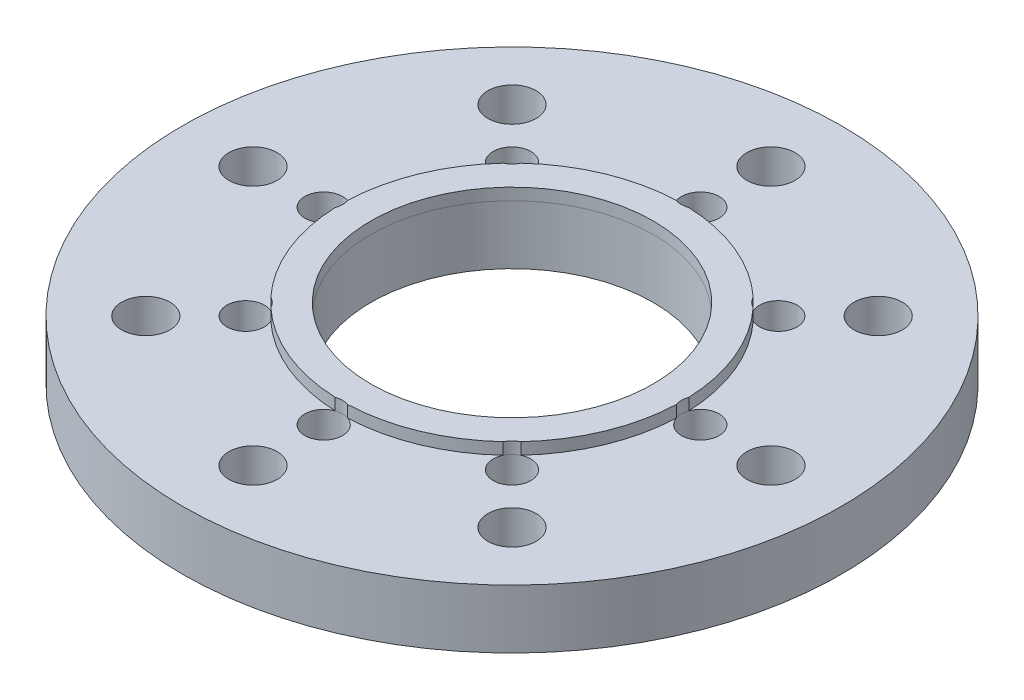
ISO-10303-21;
HEADER;
FILE_DESCRIPTION(('STEP AP214'),'2;1');
FILE_NAME('part.step','',(''),(''),'','','');
FILE_SCHEMA(('AUTOMOTIVE_DESIGN { 1 0 10303 214 1 1 1 1 }'));
ENDSEC;
DATA;
#1=APPLICATION_CONTEXT('core data for automotive mechanical design processes');
#2=APPLICATION_PROTOCOL_DEFINITION('international standard','automotive_design',2000,#1);
#3=PRODUCT_CONTEXT('',#1,'mechanical');
#4=PRODUCT('Part','Part','',(#3));
#5=PRODUCT_RELATED_PRODUCT_CATEGORY('part','',(#4));
#6=PRODUCT_DEFINITION_FORMATION('','',#4);
#7=PRODUCT_DEFINITION_CONTEXT('part definition',#1,'design');
#8=PRODUCT_DEFINITION('design','',#6,#7);
#9=PRODUCT_DEFINITION_SHAPE('','',#8);
#10=(LENGTH_UNIT() NAMED_UNIT(*) SI_UNIT(.MILLI.,.METRE.));
#11=(NAMED_UNIT(*) PLANE_ANGLE_UNIT() SI_UNIT($,.RADIAN.));
#12=(NAMED_UNIT(*) SI_UNIT($,.STERADIAN.) SOLID_ANGLE_UNIT());
#13=UNCERTAINTY_MEASURE_WITH_UNIT(LENGTH_MEASURE(1.E-05),#10,'distance_accuracy_value','');
#14=(GEOMETRIC_REPRESENTATION_CONTEXT(3) GLOBAL_UNCERTAINTY_ASSIGNED_CONTEXT((#13)) GLOBAL_UNIT_ASSIGNED_CONTEXT((#10,
#11,#12)) REPRESENTATION_CONTEXT('',''));
#15=CARTESIAN_POINT('',(0.,0.,0.));
#16=DIRECTION('',(0.,0.,1.));
#17=DIRECTION('',(1.,0.,0.));
#18=AXIS2_PLACEMENT_3D('',#15,#16,#17);
#19=CARTESIAN_POINT('',(0.,3.,0.));
#20=DIRECTION('',(0.,-1.,0.));
#21=DIRECTION('',(0.,0.,-1.));
#22=AXIS2_PLACEMENT_3D('',#19,#20,#21);
#23=CYLINDRICAL_SURFACE('',#22,7.25);
#24=CARTESIAN_POINT('',(0.,2.5,0.));
#25=DIRECTION('',(0.,1.,0.));
#26=DIRECTION('',(0.,0.,1.));
#27=AXIS2_PLACEMENT_3D('',#24,#25,#26);
#28=CIRCLE('',#27,7.25);
#29=CARTESIAN_POINT('',(-5.310463616953,2.5,-4.9357346133092));
#30=VERTEX_POINT('',#29);
#31=CARTESIAN_POINT('',(-7.24515625,2.5,-0.264973419583771));
#32=VERTEX_POINT('',#31);
#33=EDGE_CURVE('E194',#30,#32,#28,.T.);
#34=ORIENTED_EDGE('',*,*,#33,.T.);
#35=DIRECTION('',(0.,1.,0.));
#36=VECTOR('',#35,1.);
#37=CARTESIAN_POINT('',(-7.24515625,1.5,-0.264973419583772));
#38=LINE('',#37,#36);
#39=CARTESIAN_POINT('',(-7.24515625,3.,-0.264973419583774));
#40=VERTEX_POINT('',#39);
#41=EDGE_CURVE('E176',#32,#40,#38,.T.);
#42=ORIENTED_EDGE('',*,*,#41,.T.);
#43=CARTESIAN_POINT('',(0.,3.,0.));
#44=DIRECTION('',(0.,1.,0.));
#45=DIRECTION('',(0.,0.,1.));
#46=AXIS2_PLACEMENT_3D('',#43,#44,#45);
#47=CIRCLE('',#46,7.25);
#48=CARTESIAN_POINT('',(-5.310463616953,3.,-4.93573461330919));
#49=VERTEX_POINT('',#48);
#50=EDGE_CURVE('E175',#49,#40,#47,.T.);
#51=ORIENTED_EDGE('',*,*,#50,.F.);
#52=DIRECTION('',(0.,1.,0.));
#53=VECTOR('',#52,1.);
#54=CARTESIAN_POINT('',(-5.31046361695299,1.5,-4.93573461330919));
#55=LINE('',#54,#53);
#56=EDGE_CURVE('E217',#49,#30,#55,.F.);
#57=ORIENTED_EDGE('',*,*,#56,.T.);
#58=EDGE_LOOP('',(#34,#42,#51,#57));
#59=FACE_BOUND('',#58,.T.);
#60=ADVANCED_FACE('F42',(#59),#23,.T.);
#61=CARTESIAN_POINT('',(-7.24515625,3.,0.264973419583825));
#62=VERTEX_POINT('',#61);
#63=CARTESIAN_POINT('',(-5.31046361695296,3.,4.93573461330923));
#64=VERTEX_POINT('',#63);
#65=EDGE_CURVE('E172',#62,#64,#47,.T.);
#66=ORIENTED_EDGE('',*,*,#65,.F.);
#67=DIRECTION('',(0.,1.,0.));
#68=VECTOR('',#67,1.);
#69=CARTESIAN_POINT('',(-7.24515625,1.5,0.264973419583823));
#70=LINE('',#69,#68);
#71=CARTESIAN_POINT('',(-7.24515625,2.5,0.264973419583823));
#72=VERTEX_POINT('',#71);
#73=EDGE_CURVE('E154',#62,#72,#70,.F.);
#74=ORIENTED_EDGE('',*,*,#73,.T.);
#75=CARTESIAN_POINT('',(-5.31046361695296,2.5,4.93573461330924));
#76=VERTEX_POINT('',#75);
#77=EDGE_CURVE('E257',#72,#76,#28,.T.);
#78=ORIENTED_EDGE('',*,*,#77,.T.);
#79=DIRECTION('',(0.,1.,0.));
#80=VECTOR('',#79,1.);
#81=CARTESIAN_POINT('',(-5.31046361695296,1.5,4.93573461330923));
#82=LINE('',#81,#80);
#83=EDGE_CURVE('E180',#76,#64,#82,.T.);
#84=ORIENTED_EDGE('',*,*,#83,.T.);
#85=EDGE_LOOP('',(#66,#74,#78,#84));
#86=FACE_BOUND('',#85,.T.);
#87=ADVANCED_FACE('F179',(#86),#23,.T.);
#88=CARTESIAN_POINT('',(-4.93573461330918,3.,5.31046361695301));
#89=VERTEX_POINT('',#88);
#90=CARTESIAN_POINT('',(-0.264973419583799,3.,7.24515625));
#91=VERTEX_POINT('',#90);
#92=EDGE_CURVE('E181',#89,#91,#47,.T.);
#93=ORIENTED_EDGE('',*,*,#92,.F.);
#94=DIRECTION('',(0.,1.,0.));
#95=VECTOR('',#94,1.);
#96=CARTESIAN_POINT('',(-4.93573461330918,1.5,5.31046361695301));
#97=LINE('',#96,#95);
#98=CARTESIAN_POINT('',(-4.93573461330918,2.5,5.31046361695302));
#99=VERTEX_POINT('',#98);
#100=EDGE_CURVE('E327',#89,#99,#97,.F.);
#101=ORIENTED_EDGE('',*,*,#100,.T.);
#102=CARTESIAN_POINT('',(-0.264973419583796,2.5,7.24515625));
#103=VERTEX_POINT('',#102);
#104=EDGE_CURVE('E258',#99,#103,#28,.T.);
#105=ORIENTED_EDGE('',*,*,#104,.T.);
#106=DIRECTION('',(0.,1.,0.));
#107=VECTOR('',#106,1.);
#108=CARTESIAN_POINT('',(-0.264973419583798,1.5,7.24515625));
#109=LINE('',#108,#107);
#110=EDGE_CURVE('E308',#103,#91,#109,.T.);
#111=ORIENTED_EDGE('',*,*,#110,.T.);
#112=EDGE_LOOP('',(#93,#101,#105,#111));
#113=FACE_BOUND('',#112,.T.);
#114=ADVANCED_FACE('F256',(#113),#23,.T.);
#115=CARTESIAN_POINT('',(0.264973419583799,3.,7.24515625));
#116=VERTEX_POINT('',#115);
#117=CARTESIAN_POINT('',(4.93573461330925,3.,5.31046361695295));
#118=VERTEX_POINT('',#117);
#119=EDGE_CURVE('E185',#116,#118,#47,.T.);
#120=ORIENTED_EDGE('',*,*,#119,.F.);
#121=DIRECTION('',(0.,1.,0.));
#122=VECTOR('',#121,1.);
#123=CARTESIAN_POINT('',(0.264973419583798,1.5,7.24515625));
#124=LINE('',#123,#122);
#125=CARTESIAN_POINT('',(0.264973419583798,2.5,7.24515625));
#126=VERTEX_POINT('',#125);
#127=EDGE_CURVE('E316',#116,#126,#124,.F.);
#128=ORIENTED_EDGE('',*,*,#127,.T.);
#129=CARTESIAN_POINT('',(4.93573461330925,2.5,5.31046361695295));
#130=VERTEX_POINT('',#129);
#131=EDGE_CURVE('E260',#126,#130,#28,.T.);
#132=ORIENTED_EDGE('',*,*,#131,.T.);
#133=DIRECTION('',(0.,1.,0.));
#134=VECTOR('',#133,1.);
#135=CARTESIAN_POINT('',(4.93573461330925,1.5,5.31046361695294));
#136=LINE('',#135,#134);
#137=EDGE_CURVE('E296',#130,#118,#136,.T.);
#138=ORIENTED_EDGE('',*,*,#137,.T.);
#139=EDGE_LOOP('',(#120,#128,#132,#138));
#140=FACE_BOUND('',#139,.T.);
#141=ADVANCED_FACE('F335',(#140),#23,.T.);
#142=CARTESIAN_POINT('',(5.31046361695303,3.,4.93573461330916));
#143=VERTEX_POINT('',#142);
#144=CARTESIAN_POINT('',(7.24515625,3.,0.264973419583723));
#145=VERTEX_POINT('',#144);
#146=EDGE_CURVE('E343',#143,#145,#47,.T.);
#147=ORIENTED_EDGE('',*,*,#146,.F.);
#148=DIRECTION('',(0.,1.,0.));
#149=VECTOR('',#148,1.);
#150=CARTESIAN_POINT('',(5.31046361695303,1.5,4.93573461330916));
#151=LINE('',#150,#149);
#152=CARTESIAN_POINT('',(5.31046361695303,2.5,4.93573461330916));
#153=VERTEX_POINT('',#152);
#154=EDGE_CURVE('E303',#143,#153,#151,.F.);
#155=ORIENTED_EDGE('',*,*,#154,.T.);
#156=CARTESIAN_POINT('',(7.24515625,2.5,0.26497341958372));
#157=VERTEX_POINT('',#156);
#158=EDGE_CURVE('E266',#153,#157,#28,.T.);
#159=ORIENTED_EDGE('',*,*,#158,.T.);
#160=DIRECTION('',(0.,1.,0.));
#161=VECTOR('',#160,1.);
#162=CARTESIAN_POINT('',(7.24515625,1.5,0.264973419583722));
#163=LINE('',#162,#161);
#164=EDGE_CURVE('E289',#157,#145,#163,.T.);
#165=ORIENTED_EDGE('',*,*,#164,.T.);
#166=EDGE_LOOP('',(#147,#155,#159,#165));
#167=FACE_BOUND('',#166,.T.);
#168=ADVANCED_FACE('F339',(#167),#23,.T.);
#169=CARTESIAN_POINT('',(7.24515624999999,3.,-0.264973419583875));
#170=VERTEX_POINT('',#169);
#171=CARTESIAN_POINT('',(5.31046361695293,3.,-4.93573461330927));
#172=VERTEX_POINT('',#171);
#173=EDGE_CURVE('E344',#170,#172,#47,.T.);
#174=ORIENTED_EDGE('',*,*,#173,.F.);
#175=DIRECTION('',(0.,1.,0.));
#176=VECTOR('',#175,1.);
#177=CARTESIAN_POINT('',(7.24515624999999,1.5,-0.264973419583873));
#178=LINE('',#177,#176);
#179=CARTESIAN_POINT('',(7.24515625,2.5,-0.264973419583874));
#180=VERTEX_POINT('',#179);
#181=EDGE_CURVE('E283',#170,#180,#178,.F.);
#182=ORIENTED_EDGE('',*,*,#181,.T.);
#183=CARTESIAN_POINT('',(5.31046361695293,2.5,-4.93573461330927));
#184=VERTEX_POINT('',#183);
#185=EDGE_CURVE('E235',#180,#184,#28,.T.);
#186=ORIENTED_EDGE('',*,*,#185,.T.);
#187=DIRECTION('',(0.,1.,0.));
#188=VECTOR('',#187,1.);
#189=CARTESIAN_POINT('',(5.31046361695293,1.5,-4.93573461330927));
#190=LINE('',#189,#188);
#191=EDGE_CURVE('E223',#184,#172,#190,.T.);
#192=ORIENTED_EDGE('',*,*,#191,.T.);
#193=EDGE_LOOP('',(#174,#182,#186,#192));
#194=FACE_BOUND('',#193,.T.);
#195=ADVANCED_FACE('F281',(#194),#23,.T.);
#196=CARTESIAN_POINT('',(-0.264973419583798,2.5,-7.24515625));
#197=VERTEX_POINT('',#196);
#198=CARTESIAN_POINT('',(-4.93573461330922,2.5,-5.31046361695298));
#199=VERTEX_POINT('',#198);
#200=EDGE_CURVE('E192',#197,#199,#28,.T.);
#201=ORIENTED_EDGE('',*,*,#200,.T.);
#202=DIRECTION('',(0.,1.,0.));
#203=VECTOR('',#202,1.);
#204=CARTESIAN_POINT('',(-4.93573461330921,1.5,-5.31046361695298));
#205=LINE('',#204,#203);
#206=CARTESIAN_POINT('',(-4.93573461330921,3.,-5.31046361695298));
#207=VERTEX_POINT('',#206);
#208=EDGE_CURVE('E227',#199,#207,#205,.T.);
#209=ORIENTED_EDGE('',*,*,#208,.T.);
#210=CARTESIAN_POINT('',(-0.264973419583799,3.,-7.24515625));
#211=VERTEX_POINT('',#210);
#212=EDGE_CURVE('E183',#211,#207,#47,.T.);
#213=ORIENTED_EDGE('',*,*,#212,.F.);
#214=DIRECTION('',(0.,1.,0.));
#215=VECTOR('',#214,1.);
#216=CARTESIAN_POINT('',(-0.264973419583798,1.5,-7.24515625));
#217=LINE('',#216,#215);
#218=EDGE_CURVE('E50',#211,#197,#217,.F.);
#219=ORIENTED_EDGE('',*,*,#218,.T.);
#220=EDGE_LOOP('',(#201,#209,#213,#219));
#221=FACE_BOUND('',#220,.T.);
#222=ADVANCED_FACE('F200',(#221),#23,.T.);
#223=CARTESIAN_POINT('',(0.,3.,0.));
#224=DIRECTION('',(0.,1.,0.));
#225=DIRECTION('',(0.,0.,1.));
#226=AXIS2_PLACEMENT_3D('',#223,#224,#225);
#227=PLANE('',#226);
#228=CARTESIAN_POINT('',(-8.,3.,0.));
#229=DIRECTION('',(0.,1.,0.));
#230=DIRECTION('',(1.,0.,0.));
#231=AXIS2_PLACEMENT_3D('',#228,#229,#230);
#232=CIRCLE('',#231,0.8);
#233=EDGE_CURVE('E157',#62,#40,#232,.T.);
#234=ORIENTED_EDGE('',*,*,#233,.F.);
#235=ORIENTED_EDGE('',*,*,#65,.T.);
#236=CARTESIAN_POINT('',(-5.65685424949235,3.,5.65685424949241));
#237=DIRECTION('',(0.,1.,0.));
#238=DIRECTION('',(0.707106781186544,0.,-0.707106781186551));
#239=AXIS2_PLACEMENT_3D('',#236,#237,#238);
#240=CIRCLE('',#239,0.8);
#241=EDGE_CURVE('E329',#89,#64,#240,.T.);
#242=ORIENTED_EDGE('',*,*,#241,.F.);
#243=ORIENTED_EDGE('',*,*,#92,.T.);
#244=CARTESIAN_POINT('',(0.,3.,8.));
#245=DIRECTION('',(0.,1.,0.));
#246=DIRECTION('',(0.,0.,-1.));
#247=AXIS2_PLACEMENT_3D('',#244,#245,#246);
#248=CIRCLE('',#247,0.8);
#249=EDGE_CURVE('E318',#116,#91,#248,.T.);
#250=ORIENTED_EDGE('',*,*,#249,.F.);
#251=ORIENTED_EDGE('',*,*,#119,.T.);
#252=CARTESIAN_POINT('',(5.65685424949243,3.,5.65685424949233));
#253=DIRECTION('',(0.,1.,0.));
#254=DIRECTION('',(-0.707106781186554,0.,-0.707106781186541));
#255=AXIS2_PLACEMENT_3D('',#252,#253,#254);
#256=CIRCLE('',#255,0.8);
#257=EDGE_CURVE('E305',#143,#118,#256,.T.);
#258=ORIENTED_EDGE('',*,*,#257,.F.);
#259=ORIENTED_EDGE('',*,*,#146,.T.);
#260=CARTESIAN_POINT('',(8.,3.,0.));
#261=DIRECTION('',(0.,1.,0.));
#262=DIRECTION('',(-1.,0.,0.));
#263=AXIS2_PLACEMENT_3D('',#260,#261,#262);
#264=CIRCLE('',#263,0.8);
#265=EDGE_CURVE('E293',#170,#145,#264,.T.);
#266=ORIENTED_EDGE('',*,*,#265,.F.);
#267=ORIENTED_EDGE('',*,*,#173,.T.);
#268=CARTESIAN_POINT('',(5.65685424949231,3.,-5.65685424949245));
#269=DIRECTION('',(0.,1.,0.));
#270=DIRECTION('',(-0.707106781186539,0.,0.707106781186556));
#271=AXIS2_PLACEMENT_3D('',#268,#269,#270);
#272=CIRCLE('',#271,0.8);
#273=CARTESIAN_POINT('',(4.93573461330914,3.,-5.31046361695305));
#274=VERTEX_POINT('',#273);
#275=EDGE_CURVE('E286',#274,#172,#272,.T.);
#276=ORIENTED_EDGE('',*,*,#275,.F.);
#277=CARTESIAN_POINT('',(0.264973419583799,3.,-7.24515625));
#278=VERTEX_POINT('',#277);
#279=EDGE_CURVE('E189',#274,#278,#47,.T.);
#280=ORIENTED_EDGE('',*,*,#279,.T.);
#281=CARTESIAN_POINT('',(0.,3.,-8.));
#282=DIRECTION('',(0.,1.,0.));
#283=DIRECTION('',(0.,0.,1.));
#284=AXIS2_PLACEMENT_3D('',#281,#282,#283);
#285=CIRCLE('',#284,0.8);
#286=EDGE_CURVE('E229',#211,#278,#285,.T.);
#287=ORIENTED_EDGE('',*,*,#286,.F.);
#288=ORIENTED_EDGE('',*,*,#212,.T.);
#289=CARTESIAN_POINT('',(-5.65685424949239,3.,-5.65685424949237));
#290=DIRECTION('',(0.,1.,0.));
#291=DIRECTION('',(0.707106781186549,0.,0.707106781186546));
#292=AXIS2_PLACEMENT_3D('',#289,#290,#291);
#293=CIRCLE('',#292,0.8);
#294=EDGE_CURVE('E219',#49,#207,#293,.T.);
#295=ORIENTED_EDGE('',*,*,#294,.F.);
#296=ORIENTED_EDGE('',*,*,#50,.T.);
#297=EDGE_LOOP('',(#234,#235,#242,#243,#250,#251,#258,#259,#266,#267,#276,#280,#287,#288,#295,#296));
#298=FACE_BOUND('',#297,.T.);
#299=CARTESIAN_POINT('',(0.,3.,0.));
#300=DIRECTION('',(0.,1.,0.));
#301=DIRECTION('',(0.,0.,1.));
#302=AXIS2_PLACEMENT_3D('',#299,#300,#301);
#303=CIRCLE('',#302,6.);
#304=CARTESIAN_POINT('',(0.,3.,6.));
#305=VERTEX_POINT('',#304);
#306=EDGE_CURVE('E231',#305,#305,#303,.T.);
#307=ORIENTED_EDGE('',*,*,#306,.F.);
#308=EDGE_LOOP('',(#307));
#309=FACE_BOUND('',#308,.T.);
#310=ADVANCED_FACE('F169',(#298,#309),#227,.T.);
#311=CARTESIAN_POINT('',(0.,2.5,0.));
#312=DIRECTION('',(0.,1.,0.));
#313=DIRECTION('',(0.,0.,1.));
#314=AXIS2_PLACEMENT_3D('',#311,#312,#313);
#315=PLANE('',#314);
#316=ORIENTED_EDGE('',*,*,#77,.F.);
#317=CARTESIAN_POINT('',(-8.,2.5,0.));
#318=DIRECTION('',(0.,1.,0.));
#319=DIRECTION('',(1.,0.,0.));
#320=AXIS2_PLACEMENT_3D('',#317,#318,#319);
#321=CIRCLE('',#320,0.799999999999999);
#322=EDGE_CURVE('E160',#72,#32,#321,.T.);
#323=ORIENTED_EDGE('',*,*,#322,.T.);
#324=ORIENTED_EDGE('',*,*,#33,.F.);
#325=CARTESIAN_POINT('',(-5.65685424949239,2.5,-5.65685424949237));
#326=DIRECTION('',(0.,1.,0.));
#327=DIRECTION('',(0.707106781186549,0.,0.707106781186546));
#328=AXIS2_PLACEMENT_3D('',#325,#326,#327);
#329=CIRCLE('',#328,0.799999999999999);
#330=EDGE_CURVE('E213',#30,#199,#329,.T.);
#331=ORIENTED_EDGE('',*,*,#330,.T.);
#332=ORIENTED_EDGE('',*,*,#200,.F.);
#333=CARTESIAN_POINT('',(0.,2.5,-8.));
#334=DIRECTION('',(0.,1.,0.));
#335=DIRECTION('',(0.,0.,1.));
#336=AXIS2_PLACEMENT_3D('',#333,#334,#335);
#337=CIRCLE('',#336,0.799999999999999);
#338=CARTESIAN_POINT('',(0.264973419583796,2.5,-7.24515625));
#339=VERTEX_POINT('',#338);
#340=EDGE_CURVE('E211',#197,#339,#337,.T.);
#341=ORIENTED_EDGE('',*,*,#340,.T.);
#342=CARTESIAN_POINT('',(4.93573461330914,2.5,-5.31046361695305));
#343=VERTEX_POINT('',#342);
#344=EDGE_CURVE('E195',#343,#339,#28,.T.);
#345=ORIENTED_EDGE('',*,*,#344,.F.);
#346=CARTESIAN_POINT('',(5.65685424949231,2.5,-5.65685424949245));
#347=DIRECTION('',(0.,1.,0.));
#348=DIRECTION('',(-0.707106781186539,0.,0.707106781186556));
#349=AXIS2_PLACEMENT_3D('',#346,#347,#348);
#350=CIRCLE('',#349,0.799999999999999);
#351=EDGE_CURVE('E57',#343,#184,#350,.T.);
#352=ORIENTED_EDGE('',*,*,#351,.T.);
#353=ORIENTED_EDGE('',*,*,#185,.F.);
#354=CARTESIAN_POINT('',(8.,2.5,0.));
#355=DIRECTION('',(0.,1.,0.));
#356=DIRECTION('',(-1.,0.,0.));
#357=AXIS2_PLACEMENT_3D('',#354,#355,#356);
#358=CIRCLE('',#357,0.799999999999999);
#359=EDGE_CURVE('E65',#180,#157,#358,.T.);
#360=ORIENTED_EDGE('',*,*,#359,.T.);
#361=ORIENTED_EDGE('',*,*,#158,.F.);
#362=CARTESIAN_POINT('',(5.65685424949243,2.5,5.65685424949233));
#363=DIRECTION('',(0.,1.,0.));
#364=DIRECTION('',(-0.707106781186554,0.,-0.707106781186541));
#365=AXIS2_PLACEMENT_3D('',#362,#363,#364);
#366=CIRCLE('',#365,0.799999999999999);
#367=EDGE_CURVE('E299',#153,#130,#366,.T.);
#368=ORIENTED_EDGE('',*,*,#367,.T.);
#369=ORIENTED_EDGE('',*,*,#131,.F.);
#370=CARTESIAN_POINT('',(0.,2.5,8.));
#371=DIRECTION('',(0.,1.,0.));
#372=DIRECTION('',(0.,0.,-1.));
#373=AXIS2_PLACEMENT_3D('',#370,#371,#372);
#374=CIRCLE('',#373,0.799999999999999);
#375=EDGE_CURVE('E312',#126,#103,#374,.T.);
#376=ORIENTED_EDGE('',*,*,#375,.T.);
#377=ORIENTED_EDGE('',*,*,#104,.F.);
#378=CARTESIAN_POINT('',(-5.65685424949235,2.5,5.65685424949241));
#379=DIRECTION('',(0.,1.,0.));
#380=DIRECTION('',(0.707106781186544,0.,-0.707106781186551));
#381=AXIS2_PLACEMENT_3D('',#378,#379,#380);
#382=CIRCLE('',#381,0.799999999999999);
#383=EDGE_CURVE('E324',#99,#76,#382,.T.);
#384=ORIENTED_EDGE('',*,*,#383,.T.);
#385=EDGE_LOOP('',(#316,#323,#324,#331,#332,#341,#345,#352,#353,#360,#361,#368,#369,#376,#377,#384));
#386=FACE_BOUND('',#385,.T.);
#387=CARTESIAN_POINT('',(0.,2.5,0.));
#388=DIRECTION('',(0.,1.,0.));
#389=DIRECTION('',(0.,0.,1.));
#390=AXIS2_PLACEMENT_3D('',#387,#388,#389);
#391=CIRCLE('',#390,6.);
#392=CARTESIAN_POINT('',(0.,2.5,6.));
#393=VERTEX_POINT('',#392);
#394=EDGE_CURVE('E190',#393,#393,#391,.T.);
#395=ORIENTED_EDGE('',*,*,#394,.T.);
#396=EDGE_LOOP('',(#395));
#397=FACE_BOUND('',#396,.T.);
#398=ADVANCED_FACE('F208',(#386,#397),#315,.F.);
#399=ORIENTED_EDGE('',*,*,#279,.F.);
#400=DIRECTION('',(0.,1.,0.));
#401=VECTOR('',#400,1.);
#402=CARTESIAN_POINT('',(4.93573461330914,1.5,-5.31046361695305));
#403=LINE('',#402,#401);
#404=EDGE_CURVE('E284',#274,#343,#403,.F.);
#405=ORIENTED_EDGE('',*,*,#404,.T.);
#406=ORIENTED_EDGE('',*,*,#344,.T.);
#407=DIRECTION('',(0.,1.,0.));
#408=VECTOR('',#407,1.);
#409=CARTESIAN_POINT('',(0.264973419583798,1.5,-7.24515625));
#410=LINE('',#409,#408);
#411=EDGE_CURVE('E12',#339,#278,#410,.T.);
#412=ORIENTED_EDGE('',*,*,#411,.T.);
#413=EDGE_LOOP('',(#399,#405,#406,#412));
#414=FACE_BOUND('',#413,.T.);
#415=ADVANCED_FACE('F44',(#414),#23,.T.);
#416=CARTESIAN_POINT('',(0.,3.,0.));
#417=DIRECTION('',(0.,-1.,0.));
#418=DIRECTION('',(0.,0.,-1.));
#419=AXIS2_PLACEMENT_3D('',#416,#417,#418);
#420=CYLINDRICAL_SURFACE('',#419,6.);
#421=ORIENTED_EDGE('',*,*,#306,.T.);
#422=EDGE_LOOP('',(#421));
#423=FACE_BOUND('',#422,.T.);
#424=ORIENTED_EDGE('',*,*,#394,.F.);
#425=EDGE_LOOP('',(#424));
#426=FACE_BOUND('',#425,.T.);
#427=ADVANCED_FACE('F239',(#423,#426),#420,.F.);
#428=CARTESIAN_POINT('',(0.,3.,-8.));
#429=DIRECTION('',(0.,1.,0.));
#430=DIRECTION('',(0.,0.,1.));
#431=AXIS2_PLACEMENT_3D('',#428,#429,#430);
#432=CYLINDRICAL_SURFACE('',#431,0.799999999999999);
#433=ORIENTED_EDGE('',*,*,#340,.F.);
#434=ORIENTED_EDGE('',*,*,#218,.F.);
#435=ORIENTED_EDGE('',*,*,#286,.T.);
#436=ORIENTED_EDGE('',*,*,#411,.F.);
#437=EDGE_LOOP('',(#433,#434,#435,#436));
#438=FACE_BOUND('',#437,.T.);
#439=ADVANCED_FACE('F241',(#438),#432,.F.);
#440=CARTESIAN_POINT('',(-5.65685424949239,3.,-5.65685424949237));
#441=DIRECTION('',(0.,1.,0.));
#442=DIRECTION('',(0.707106781186549,0.,0.707106781186546));
#443=AXIS2_PLACEMENT_3D('',#440,#441,#442);
#444=CYLINDRICAL_SURFACE('',#443,0.799999999999999);
#445=ORIENTED_EDGE('',*,*,#330,.F.);
#446=ORIENTED_EDGE('',*,*,#56,.F.);
#447=ORIENTED_EDGE('',*,*,#294,.T.);
#448=ORIENTED_EDGE('',*,*,#208,.F.);
#449=EDGE_LOOP('',(#445,#446,#447,#448));
#450=FACE_BOUND('',#449,.T.);
#451=ADVANCED_FACE('F247',(#450),#444,.F.);
#452=CARTESIAN_POINT('',(5.65685424949231,3.,-5.65685424949245));
#453=DIRECTION('',(0.,1.,0.));
#454=DIRECTION('',(-0.707106781186539,0.,0.707106781186556));
#455=AXIS2_PLACEMENT_3D('',#452,#453,#454);
#456=CYLINDRICAL_SURFACE('',#455,0.799999999999999);
#457=ORIENTED_EDGE('',*,*,#351,.F.);
#458=ORIENTED_EDGE('',*,*,#404,.F.);
#459=ORIENTED_EDGE('',*,*,#275,.T.);
#460=ORIENTED_EDGE('',*,*,#191,.F.);
#461=EDGE_LOOP('',(#457,#458,#459,#460));
#462=FACE_BOUND('',#461,.T.);
#463=ADVANCED_FACE('F347',(#462),#456,.F.);
#464=CARTESIAN_POINT('',(8.,3.,0.));
#465=DIRECTION('',(0.,1.,0.));
#466=DIRECTION('',(-1.,0.,0.));
#467=AXIS2_PLACEMENT_3D('',#464,#465,#466);
#468=CYLINDRICAL_SURFACE('',#467,0.799999999999999);
#469=ORIENTED_EDGE('',*,*,#359,.F.);
#470=ORIENTED_EDGE('',*,*,#181,.F.);
#471=ORIENTED_EDGE('',*,*,#265,.T.);
#472=ORIENTED_EDGE('',*,*,#164,.F.);
#473=EDGE_LOOP('',(#469,#470,#471,#472));
#474=FACE_BOUND('',#473,.T.);
#475=ADVANCED_FACE('F349',(#474),#468,.F.);
#476=CARTESIAN_POINT('',(5.65685424949243,3.,5.65685424949233));
#477=DIRECTION('',(0.,1.,0.));
#478=DIRECTION('',(-0.707106781186554,0.,-0.707106781186541));
#479=AXIS2_PLACEMENT_3D('',#476,#477,#478);
#480=CYLINDRICAL_SURFACE('',#479,0.799999999999999);
#481=ORIENTED_EDGE('',*,*,#367,.F.);
#482=ORIENTED_EDGE('',*,*,#154,.F.);
#483=ORIENTED_EDGE('',*,*,#257,.T.);
#484=ORIENTED_EDGE('',*,*,#137,.F.);
#485=EDGE_LOOP('',(#481,#482,#483,#484));
#486=FACE_BOUND('',#485,.T.);
#487=ADVANCED_FACE('F355',(#486),#480,.F.);
#488=CARTESIAN_POINT('',(0.,3.,8.));
#489=DIRECTION('',(0.,1.,0.));
#490=DIRECTION('',(0.,0.,-1.));
#491=AXIS2_PLACEMENT_3D('',#488,#489,#490);
#492=CYLINDRICAL_SURFACE('',#491,0.799999999999999);
#493=ORIENTED_EDGE('',*,*,#375,.F.);
#494=ORIENTED_EDGE('',*,*,#127,.F.);
#495=ORIENTED_EDGE('',*,*,#249,.T.);
#496=ORIENTED_EDGE('',*,*,#110,.F.);
#497=EDGE_LOOP('',(#493,#494,#495,#496));
#498=FACE_BOUND('',#497,.T.);
#499=ADVANCED_FACE('F361',(#498),#492,.F.);
#500=CARTESIAN_POINT('',(-5.65685424949235,3.,5.65685424949241));
#501=DIRECTION('',(0.,1.,0.));
#502=DIRECTION('',(0.707106781186544,0.,-0.707106781186551));
#503=AXIS2_PLACEMENT_3D('',#500,#501,#502);
#504=CYLINDRICAL_SURFACE('',#503,0.799999999999999);
#505=ORIENTED_EDGE('',*,*,#383,.F.);
#506=ORIENTED_EDGE('',*,*,#100,.F.);
#507=ORIENTED_EDGE('',*,*,#241,.T.);
#508=ORIENTED_EDGE('',*,*,#83,.F.);
#509=EDGE_LOOP('',(#505,#506,#507,#508));
#510=FACE_BOUND('',#509,.T.);
#511=ADVANCED_FACE('F333',(#510),#504,.F.);
#512=CARTESIAN_POINT('',(-8.,3.,0.));
#513=DIRECTION('',(0.,1.,0.));
#514=DIRECTION('',(1.,0.,0.));
#515=AXIS2_PLACEMENT_3D('',#512,#513,#514);
#516=CYLINDRICAL_SURFACE('',#515,0.799999999999999);
#517=ORIENTED_EDGE('',*,*,#322,.F.);
#518=ORIENTED_EDGE('',*,*,#73,.F.);
#519=ORIENTED_EDGE('',*,*,#233,.T.);
#520=ORIENTED_EDGE('',*,*,#41,.F.);
#521=EDGE_LOOP('',(#517,#518,#519,#520));
#522=FACE_BOUND('',#521,.T.);
#523=ADVANCED_FACE('F156',(#522),#516,.F.);
#524=CLOSED_SHELL('',(#60,#87,#114,#141,#168,#195,#222,#310,#398,#415,#427,#439,#451,#463,#475,
#487,#499,#511,#523));
#525=MANIFOLD_SOLID_BREP('B2',#524);
#526=CARTESIAN_POINT('',(0.,2.5,0.));
#527=DIRECTION('',(0.,1.,0.));
#528=DIRECTION('',(0.,0.,1.));
#529=AXIS2_PLACEMENT_3D('',#526,#527,#528);
#530=PLANE('',#529);
#531=CARTESIAN_POINT('',(-8.,2.5,0.));
#532=DIRECTION('',(0.,1.,0.));
#533=DIRECTION('',(1.,0.,0.));
#534=AXIS2_PLACEMENT_3D('',#531,#532,#533);
#535=CIRCLE('',#534,0.799999999999999);
#536=CARTESIAN_POINT('',(-7.2,2.5,0.));
#537=VERTEX_POINT('',#536);
#538=EDGE_CURVE('E600',#537,#537,#535,.T.);
#539=ORIENTED_EDGE('',*,*,#538,.F.);
#540=EDGE_LOOP('',(#539));
#541=FACE_BOUND('',#540,.T.);
#542=CARTESIAN_POINT('',(-5.65685424949235,2.5,5.65685424949241));
#543=DIRECTION('',(0.,1.,0.));
#544=DIRECTION('',(0.707106781186544,0.,-0.707106781186551));
#545=AXIS2_PLACEMENT_3D('',#542,#543,#544);
#546=CIRCLE('',#545,0.799999999999999);
#547=CARTESIAN_POINT('',(-5.09116882454312,2.5,5.09116882454317));
#548=VERTEX_POINT('',#547);
#549=EDGE_CURVE('E594',#548,#548,#546,.T.);
#550=ORIENTED_EDGE('',*,*,#549,.F.);
#551=EDGE_LOOP('',(#550));
#552=FACE_BOUND('',#551,.T.);
#553=CARTESIAN_POINT('',(0.,2.5,8.));
#554=DIRECTION('',(0.,1.,0.));
#555=DIRECTION('',(0.,0.,-1.));
#556=AXIS2_PLACEMENT_3D('',#553,#554,#555);
#557=CIRCLE('',#556,0.799999999999999);
#558=CARTESIAN_POINT('',(0.,2.5,7.2));
#559=VERTEX_POINT('',#558);
#560=EDGE_CURVE('E588',#559,#559,#557,.T.);
#561=ORIENTED_EDGE('',*,*,#560,.F.);
#562=EDGE_LOOP('',(#561));
#563=FACE_BOUND('',#562,.T.);
#564=CARTESIAN_POINT('',(5.65685424949243,2.5,5.65685424949233));
#565=DIRECTION('',(0.,1.,0.));
#566=DIRECTION('',(-0.707106781186554,0.,-0.707106781186541));
#567=AXIS2_PLACEMENT_3D('',#564,#565,#566);
#568=CIRCLE('',#567,0.799999999999999);
#569=CARTESIAN_POINT('',(5.09116882454319,2.5,5.0911688245431));
#570=VERTEX_POINT('',#569);
#571=EDGE_CURVE('E582',#570,#570,#568,.T.);
#572=ORIENTED_EDGE('',*,*,#571,.F.);
#573=EDGE_LOOP('',(#572));
#574=FACE_BOUND('',#573,.T.);
#575=CARTESIAN_POINT('',(8.,2.5,0.));
#576=DIRECTION('',(0.,1.,0.));
#577=DIRECTION('',(-1.,0.,0.));
#578=AXIS2_PLACEMENT_3D('',#575,#576,#577);
#579=CIRCLE('',#578,0.799999999999999);
#580=CARTESIAN_POINT('',(7.2,2.5,0.));
#581=VERTEX_POINT('',#580);
#582=EDGE_CURVE('E575',#581,#581,#579,.T.);
#583=ORIENTED_EDGE('',*,*,#582,.F.);
#584=EDGE_LOOP('',(#583));
#585=FACE_BOUND('',#584,.T.);
#586=CARTESIAN_POINT('',(5.65685424949231,2.5,-5.65685424949245));
#587=DIRECTION('',(0.,1.,0.));
#588=DIRECTION('',(-0.707106781186539,0.,0.707106781186556));
#589=AXIS2_PLACEMENT_3D('',#586,#587,#588);
#590=CIRCLE('',#589,0.799999999999999);
#591=CARTESIAN_POINT('',(5.09116882454308,2.5,-5.0911688245432));
#592=VERTEX_POINT('',#591);
#593=EDGE_CURVE('E576',#592,#592,#590,.T.);
#594=ORIENTED_EDGE('',*,*,#593,.F.);
#595=EDGE_LOOP('',(#594));
#596=FACE_BOUND('',#595,.T.);
#597=CARTESIAN_POINT('',(-5.65685424949239,2.5,-5.65685424949237));
#598=DIRECTION('',(0.,1.,0.));
#599=DIRECTION('',(0.707106781186549,0.,0.707106781186546));
#600=AXIS2_PLACEMENT_3D('',#597,#598,#599);
#601=CIRCLE('',#600,0.799999999999999);
#602=CARTESIAN_POINT('',(-5.09116882454315,2.5,-5.09116882454313));
#603=VERTEX_POINT('',#602);
#604=EDGE_CURVE('E568',#603,#603,#601,.T.);
#605=ORIENTED_EDGE('',*,*,#604,.F.);
#606=EDGE_LOOP('',(#605));
#607=FACE_BOUND('',#606,.T.);
#608=CARTESIAN_POINT('',(0.,2.5,-8.));
#609=DIRECTION('',(0.,1.,0.));
#610=DIRECTION('',(0.,0.,1.));
#611=AXIS2_PLACEMENT_3D('',#608,#609,#610);
#612=CIRCLE('',#611,0.799999999999999);
#613=CARTESIAN_POINT('',(0.,2.5,-7.2));
#614=VERTEX_POINT('',#613);
#615=EDGE_CURVE('E559',#614,#614,#612,.T.);
#616=ORIENTED_EDGE('',*,*,#615,.F.);
#617=EDGE_LOOP('',(#616));
#618=FACE_BOUND('',#617,.T.);
#619=CARTESIAN_POINT('',(-7.77817459305193,2.5,7.77817459305212));
#620=DIRECTION('',(0.,-1.,0.));
#621=DIRECTION('',(0.,0.,-1.));
#622=AXIS2_PLACEMENT_3D('',#619,#620,#621);
#623=CIRCLE('',#622,1.025);
#624=CARTESIAN_POINT('',(-7.77817459305193,2.5,6.75317459305212));
#625=VERTEX_POINT('',#624);
#626=EDGE_CURVE('E553',#625,#625,#623,.T.);
#627=ORIENTED_EDGE('',*,*,#626,.T.);
#628=EDGE_LOOP('',(#627));
#629=FACE_BOUND('',#628,.T.);
#630=CARTESIAN_POINT('',(0.,2.5,0.));
#631=DIRECTION('',(0.,1.,0.));
#632=DIRECTION('',(0.,0.,1.));
#633=AXIS2_PLACEMENT_3D('',#630,#631,#632);
#634=CIRCLE('',#633,6.);
#635=CARTESIAN_POINT('',(0.,2.5,6.));
#636=VERTEX_POINT('',#635);
#637=EDGE_CURVE('E504',#636,#636,#634,.T.);
#638=ORIENTED_EDGE('',*,*,#637,.F.);
#639=EDGE_LOOP('',(#638));
#640=FACE_BOUND('',#639,.T.);
#641=CARTESIAN_POINT('',(0.,2.5,0.));
#642=DIRECTION('',(0.,1.,0.));
#643=DIRECTION('',(0.,0.,1.));
#644=AXIS2_PLACEMENT_3D('',#641,#642,#643);
#645=CIRCLE('',#644,14.);
#646=CARTESIAN_POINT('',(0.,2.5,14.));
#647=VERTEX_POINT('',#646);
#648=EDGE_CURVE('E41',#647,#647,#645,.T.);
#649=ORIENTED_EDGE('',*,*,#648,.T.);
#650=EDGE_LOOP('',(#649));
#651=FACE_BOUND('',#650,.T.);
#652=CARTESIAN_POINT('',(0.,2.5,11.));
#653=DIRECTION('',(0.,1.,0.));
#654=DIRECTION('',(0.,0.,1.));
#655=AXIS2_PLACEMENT_3D('',#652,#653,#654);
#656=CIRCLE('',#655,1.025);
#657=CARTESIAN_POINT('',(0.,2.5,12.025));
#658=VERTEX_POINT('',#657);
#659=EDGE_CURVE('E509',#658,#658,#656,.T.);
#660=ORIENTED_EDGE('',*,*,#659,.F.);
#661=EDGE_LOOP('',(#660));
#662=FACE_BOUND('',#661,.T.);
#663=CARTESIAN_POINT('',(7.77817459305204,2.5,7.77817459305201));
#664=DIRECTION('',(0.,-1.,0.));
#665=DIRECTION('',(0.,0.,-1.));
#666=AXIS2_PLACEMENT_3D('',#663,#664,#665);
#667=CIRCLE('',#666,1.025);
#668=CARTESIAN_POINT('',(7.77817459305204,2.5,6.75317459305201));
#669=VERTEX_POINT('',#668);
#670=EDGE_CURVE('E517',#669,#669,#667,.T.);
#671=ORIENTED_EDGE('',*,*,#670,.T.);
#672=EDGE_LOOP('',(#671));
#673=FACE_BOUND('',#672,.T.);
#674=CARTESIAN_POINT('',(11.,2.5,0.));
#675=DIRECTION('',(0.,-1.,0.));
#676=DIRECTION('',(0.,0.,-1.));
#677=AXIS2_PLACEMENT_3D('',#674,#675,#676);
#678=CIRCLE('',#677,1.025);
#679=CARTESIAN_POINT('',(11.,2.5,-1.02500000000004));
#680=VERTEX_POINT('',#679);
#681=EDGE_CURVE('E523',#680,#680,#678,.T.);
#682=ORIENTED_EDGE('',*,*,#681,.T.);
#683=EDGE_LOOP('',(#682));
#684=FACE_BOUND('',#683,.T.);
#685=CARTESIAN_POINT('',(7.77817459305198,2.5,-7.77817459305206));
#686=DIRECTION('',(0.,-1.,0.));
#687=DIRECTION('',(0.,0.,-1.));
#688=AXIS2_PLACEMENT_3D('',#685,#686,#687);
#689=CIRCLE('',#688,1.025);
#690=CARTESIAN_POINT('',(7.77817459305198,2.5,-8.80317459305206));
#691=VERTEX_POINT('',#690);
#692=EDGE_CURVE('E529',#691,#691,#689,.T.);
#693=ORIENTED_EDGE('',*,*,#692,.T.);
#694=EDGE_LOOP('',(#693));
#695=FACE_BOUND('',#694,.T.);
#696=CARTESIAN_POINT('',(0.,2.5,-11.));
#697=DIRECTION('',(0.,-1.,0.));
#698=DIRECTION('',(0.,0.,-1.));
#699=AXIS2_PLACEMENT_3D('',#696,#697,#698);
#700=CIRCLE('',#699,1.025);
#701=CARTESIAN_POINT('',(0.,2.5,-12.025));
#702=VERTEX_POINT('',#701);
#703=EDGE_CURVE('E535',#702,#702,#700,.T.);
#704=ORIENTED_EDGE('',*,*,#703,.T.);
#705=EDGE_LOOP('',(#704));
#706=FACE_BOUND('',#705,.T.);
#707=CARTESIAN_POINT('',(-7.77817459305209,2.5,-7.77817459305195));
#708=DIRECTION('',(0.,-1.,0.));
#709=DIRECTION('',(0.,0.,-1.));
#710=AXIS2_PLACEMENT_3D('',#707,#708,#709);
#711=CIRCLE('',#710,1.025);
#712=CARTESIAN_POINT('',(-7.77817459305209,2.5,-8.80317459305195));
#713=VERTEX_POINT('',#712);
#714=EDGE_CURVE('E541',#713,#713,#711,.T.);
#715=ORIENTED_EDGE('',*,*,#714,.T.);
#716=EDGE_LOOP('',(#715));
#717=FACE_BOUND('',#716,.T.);
#718=CARTESIAN_POINT('',(-11.,2.5,1.15218884181823E-13));
#719=DIRECTION('',(0.,-1.,0.));
#720=DIRECTION('',(0.,0.,-1.));
#721=AXIS2_PLACEMENT_3D('',#718,#719,#720);
#722=CIRCLE('',#721,1.025);
#723=CARTESIAN_POINT('',(-11.,2.5,-1.02499999999988));
#724=VERTEX_POINT('',#723);
#725=EDGE_CURVE('E547',#724,#724,#722,.T.);
#726=ORIENTED_EDGE('',*,*,#725,.T.);
#727=EDGE_LOOP('',(#726));
#728=FACE_BOUND('',#727,.T.);
#729=ADVANCED_FACE('F493',(#541,#552,#563,#574,#585,#596,#607,#618,#629,#640,#651,#662,#673,
#684,#695,#706,#717,#728),#530,.T.);
#730=CARTESIAN_POINT('',(0.,0.,0.));
#731=DIRECTION('',(0.,1.,0.));
#732=DIRECTION('',(0.,0.,1.));
#733=AXIS2_PLACEMENT_3D('',#730,#731,#732);
#734=PLANE('',#733);
#735=CARTESIAN_POINT('',(-8.,0.,0.));
#736=DIRECTION('',(0.,1.,0.));
#737=DIRECTION('',(1.,0.,0.));
#738=AXIS2_PLACEMENT_3D('',#735,#736,#737);
#739=CIRCLE('',#738,0.799999999999999);
#740=CARTESIAN_POINT('',(-7.2,0.,0.));
#741=VERTEX_POINT('',#740);
#742=EDGE_CURVE('E571',#741,#741,#739,.T.);
#743=ORIENTED_EDGE('',*,*,#742,.T.);
#744=EDGE_LOOP('',(#743));
#745=FACE_BOUND('',#744,.T.);
#746=CARTESIAN_POINT('',(-5.65685424949235,0.,5.65685424949241));
#747=DIRECTION('',(0.,1.,0.));
#748=DIRECTION('',(0.707106781186544,0.,-0.707106781186551));
#749=AXIS2_PLACEMENT_3D('',#746,#747,#748);
#750=CIRCLE('',#749,0.799999999999999);
#751=CARTESIAN_POINT('',(-5.09116882454312,0.,5.09116882454317));
#752=VERTEX_POINT('',#751);
#753=EDGE_CURVE('E597',#752,#752,#750,.T.);
#754=ORIENTED_EDGE('',*,*,#753,.T.);
#755=EDGE_LOOP('',(#754));
#756=FACE_BOUND('',#755,.T.);
#757=CARTESIAN_POINT('',(0.,0.,8.));
#758=DIRECTION('',(0.,1.,0.));
#759=DIRECTION('',(0.,0.,-1.));
#760=AXIS2_PLACEMENT_3D('',#757,#758,#759);
#761=CIRCLE('',#760,0.799999999999999);
#762=CARTESIAN_POINT('',(0.,0.,7.2));
#763=VERTEX_POINT('',#762);
#764=EDGE_CURVE('E591',#763,#763,#761,.T.);
#765=ORIENTED_EDGE('',*,*,#764,.T.);
#766=EDGE_LOOP('',(#765));
#767=FACE_BOUND('',#766,.T.);
#768=CARTESIAN_POINT('',(5.65685424949243,0.,5.65685424949233));
#769=DIRECTION('',(0.,1.,0.));
#770=DIRECTION('',(-0.707106781186554,0.,-0.707106781186541));
#771=AXIS2_PLACEMENT_3D('',#768,#769,#770);
#772=CIRCLE('',#771,0.799999999999999);
#773=CARTESIAN_POINT('',(5.09116882454319,0.,5.0911688245431));
#774=VERTEX_POINT('',#773);
#775=EDGE_CURVE('E585',#774,#774,#772,.T.);
#776=ORIENTED_EDGE('',*,*,#775,.T.);
#777=EDGE_LOOP('',(#776));
#778=FACE_BOUND('',#777,.T.);
#779=CARTESIAN_POINT('',(8.,0.,0.));
#780=DIRECTION('',(0.,1.,0.));
#781=DIRECTION('',(-1.,0.,0.));
#782=AXIS2_PLACEMENT_3D('',#779,#780,#781);
#783=CIRCLE('',#782,0.799999999999999);
#784=CARTESIAN_POINT('',(7.2,0.,0.));
#785=VERTEX_POINT('',#784);
#786=EDGE_CURVE('E579',#785,#785,#783,.T.);
#787=ORIENTED_EDGE('',*,*,#786,.T.);
#788=EDGE_LOOP('',(#787));
#789=FACE_BOUND('',#788,.T.);
#790=CARTESIAN_POINT('',(5.65685424949231,0.,-5.65685424949245));
#791=DIRECTION('',(0.,1.,0.));
#792=DIRECTION('',(-0.707106781186539,0.,0.707106781186556));
#793=AXIS2_PLACEMENT_3D('',#790,#791,#792);
#794=CIRCLE('',#793,0.799999999999999);
#795=CARTESIAN_POINT('',(5.09116882454308,0.,-5.0911688245432));
#796=VERTEX_POINT('',#795);
#797=EDGE_CURVE('E572',#796,#796,#794,.T.);
#798=ORIENTED_EDGE('',*,*,#797,.T.);
#799=EDGE_LOOP('',(#798));
#800=FACE_BOUND('',#799,.T.);
#801=CARTESIAN_POINT('',(-5.65685424949239,0.,-5.65685424949237));
#802=DIRECTION('',(0.,1.,0.));
#803=DIRECTION('',(0.707106781186549,0.,0.707106781186546));
#804=AXIS2_PLACEMENT_3D('',#801,#802,#803);
#805=CIRCLE('',#804,0.799999999999999);
#806=CARTESIAN_POINT('',(-5.09116882454315,0.,-5.09116882454313));
#807=VERTEX_POINT('',#806);
#808=EDGE_CURVE('E565',#807,#807,#805,.T.);
#809=ORIENTED_EDGE('',*,*,#808,.T.);
#810=EDGE_LOOP('',(#809));
#811=FACE_BOUND('',#810,.T.);
#812=CARTESIAN_POINT('',(0.,0.,-8.));
#813=DIRECTION('',(0.,1.,0.));
#814=DIRECTION('',(0.,0.,1.));
#815=AXIS2_PLACEMENT_3D('',#812,#813,#814);
#816=CIRCLE('',#815,0.799999999999999);
#817=CARTESIAN_POINT('',(0.,0.,-7.2));
#818=VERTEX_POINT('',#817);
#819=EDGE_CURVE('E562',#818,#818,#816,.T.);
#820=ORIENTED_EDGE('',*,*,#819,.T.);
#821=EDGE_LOOP('',(#820));
#822=FACE_BOUND('',#821,.T.);
#823=CARTESIAN_POINT('',(-7.77817459305193,0.,7.77817459305212));
#824=DIRECTION('',(0.,-1.,0.));
#825=DIRECTION('',(0.,0.,-1.));
#826=AXIS2_PLACEMENT_3D('',#823,#824,#825);
#827=CIRCLE('',#826,1.025);
#828=CARTESIAN_POINT('',(-7.77817459305193,0.,6.75317459305212));
#829=VERTEX_POINT('',#828);
#830=EDGE_CURVE('E556',#829,#829,#827,.T.);
#831=ORIENTED_EDGE('',*,*,#830,.F.);
#832=EDGE_LOOP('',(#831));
#833=FACE_BOUND('',#832,.T.);
#834=CARTESIAN_POINT('',(-11.,0.,1.15218884181823E-13));
#835=DIRECTION('',(0.,-1.,0.));
#836=DIRECTION('',(0.,0.,-1.));
#837=AXIS2_PLACEMENT_3D('',#834,#835,#836);
#838=CIRCLE('',#837,1.025);
#839=CARTESIAN_POINT('',(-11.,0.,-1.02499999999988));
#840=VERTEX_POINT('',#839);
#841=EDGE_CURVE('E550',#840,#840,#838,.T.);
#842=ORIENTED_EDGE('',*,*,#841,.F.);
#843=EDGE_LOOP('',(#842));
#844=FACE_BOUND('',#843,.T.);
#845=CARTESIAN_POINT('',(-7.77817459305209,0.,-7.77817459305195));
#846=DIRECTION('',(0.,-1.,0.));
#847=DIRECTION('',(0.,0.,-1.));
#848=AXIS2_PLACEMENT_3D('',#845,#846,#847);
#849=CIRCLE('',#848,1.025);
#850=CARTESIAN_POINT('',(-7.77817459305209,0.,-8.80317459305195));
#851=VERTEX_POINT('',#850);
#852=EDGE_CURVE('E544',#851,#851,#849,.T.);
#853=ORIENTED_EDGE('',*,*,#852,.F.);
#854=EDGE_LOOP('',(#853));
#855=FACE_BOUND('',#854,.T.);
#856=CARTESIAN_POINT('',(0.,0.,-11.));
#857=DIRECTION('',(0.,-1.,0.));
#858=DIRECTION('',(0.,0.,-1.));
#859=AXIS2_PLACEMENT_3D('',#856,#857,#858);
#860=CIRCLE('',#859,1.025);
#861=CARTESIAN_POINT('',(0.,0.,-12.025));
#862=VERTEX_POINT('',#861);
#863=EDGE_CURVE('E538',#862,#862,#860,.T.);
#864=ORIENTED_EDGE('',*,*,#863,.F.);
#865=EDGE_LOOP('',(#864));
#866=FACE_BOUND('',#865,.T.);
#867=CARTESIAN_POINT('',(7.77817459305198,0.,-7.77817459305206));
#868=DIRECTION('',(0.,-1.,0.));
#869=DIRECTION('',(0.,0.,-1.));
#870=AXIS2_PLACEMENT_3D('',#867,#868,#869);
#871=CIRCLE('',#870,1.025);
#872=CARTESIAN_POINT('',(7.77817459305198,0.,-8.80317459305206));
#873=VERTEX_POINT('',#872);
#874=EDGE_CURVE('E532',#873,#873,#871,.T.);
#875=ORIENTED_EDGE('',*,*,#874,.F.);
#876=EDGE_LOOP('',(#875));
#877=FACE_BOUND('',#876,.T.);
#878=CARTESIAN_POINT('',(7.77817459305204,0.,7.77817459305201));
#879=DIRECTION('',(0.,-1.,0.));
#880=DIRECTION('',(0.,0.,-1.));
#881=AXIS2_PLACEMENT_3D('',#878,#879,#880);
#882=CIRCLE('',#881,1.025);
#883=CARTESIAN_POINT('',(7.77817459305204,0.,6.75317459305201));
#884=VERTEX_POINT('',#883);
#885=EDGE_CURVE('E520',#884,#884,#882,.T.);
#886=ORIENTED_EDGE('',*,*,#885,.F.);
#887=EDGE_LOOP('',(#886));
#888=FACE_BOUND('',#887,.T.);
#889=CARTESIAN_POINT('',(0.,0.,11.));
#890=DIRECTION('',(0.,-1.,0.));
#891=DIRECTION('',(0.,0.,-1.));
#892=AXIS2_PLACEMENT_3D('',#889,#890,#891);
#893=CIRCLE('',#892,1.025);
#894=CARTESIAN_POINT('',(0.,0.,9.975));
#895=VERTEX_POINT('',#894);
#896=EDGE_CURVE('E514',#895,#895,#893,.T.);
#897=ORIENTED_EDGE('',*,*,#896,.F.);
#898=EDGE_LOOP('',(#897));
#899=FACE_BOUND('',#898,.T.);
#900=CARTESIAN_POINT('',(0.,0.,0.));
#901=DIRECTION('',(0.,1.,0.));
#902=DIRECTION('',(0.,0.,1.));
#903=AXIS2_PLACEMENT_3D('',#900,#901,#902);
#904=CIRCLE('',#903,14.);
#905=CARTESIAN_POINT('',(0.,0.,14.));
#906=VERTEX_POINT('',#905);
#907=EDGE_CURVE('E497',#906,#906,#904,.T.);
#908=ORIENTED_EDGE('',*,*,#907,.F.);
#909=EDGE_LOOP('',(#908));
#910=FACE_BOUND('',#909,.T.);
#911=CARTESIAN_POINT('',(0.,0.,0.));
#912=DIRECTION('',(0.,1.,0.));
#913=DIRECTION('',(0.,0.,1.));
#914=AXIS2_PLACEMENT_3D('',#911,#912,#913);
#915=CIRCLE('',#914,6.);
#916=CARTESIAN_POINT('',(0.,0.,6.));
#917=VERTEX_POINT('',#916);
#918=EDGE_CURVE('E506',#917,#917,#915,.T.);
#919=ORIENTED_EDGE('',*,*,#918,.T.);
#920=EDGE_LOOP('',(#919));
#921=FACE_BOUND('',#920,.T.);
#922=CARTESIAN_POINT('',(11.,0.,0.));
#923=DIRECTION('',(0.,-1.,0.));
#924=DIRECTION('',(0.,0.,-1.));
#925=AXIS2_PLACEMENT_3D('',#922,#923,#924);
#926=CIRCLE('',#925,1.025);
#927=CARTESIAN_POINT('',(11.,0.,-1.02500000000004));
#928=VERTEX_POINT('',#927);
#929=EDGE_CURVE('E526',#928,#928,#926,.T.);
#930=ORIENTED_EDGE('',*,*,#929,.F.);
#931=EDGE_LOOP('',(#930));
#932=FACE_BOUND('',#931,.T.);
#933=ADVANCED_FACE('F613',(#745,#756,#767,#778,#789,#800,#811,#822,#833,#844,#855,#866,#877,
#888,#899,#910,#921,#932),#734,.F.);
#934=CARTESIAN_POINT('',(0.,2.5,0.));
#935=DIRECTION('',(0.,-1.,0.));
#936=DIRECTION('',(0.,0.,-1.));
#937=AXIS2_PLACEMENT_3D('',#934,#935,#936);
#938=CYLINDRICAL_SURFACE('',#937,14.);
#939=ORIENTED_EDGE('',*,*,#648,.F.);
#940=EDGE_LOOP('',(#939));
#941=FACE_BOUND('',#940,.T.);
#942=ORIENTED_EDGE('',*,*,#907,.T.);
#943=EDGE_LOOP('',(#942));
#944=FACE_BOUND('',#943,.T.);
#945=ADVANCED_FACE('F495',(#941,#944),#938,.T.);
#946=CARTESIAN_POINT('',(0.,2.5,0.));
#947=DIRECTION('',(0.,-1.,0.));
#948=DIRECTION('',(0.,0.,-1.));
#949=AXIS2_PLACEMENT_3D('',#946,#947,#948);
#950=CYLINDRICAL_SURFACE('',#949,6.);
#951=ORIENTED_EDGE('',*,*,#637,.T.);
#952=EDGE_LOOP('',(#951));
#953=FACE_BOUND('',#952,.T.);
#954=ORIENTED_EDGE('',*,*,#918,.F.);
#955=EDGE_LOOP('',(#954));
#956=FACE_BOUND('',#955,.T.);
#957=ADVANCED_FACE('F694',(#953,#956),#950,.F.);
#958=CARTESIAN_POINT('',(0.,0.,11.));
#959=DIRECTION('',(0.,-1.,0.));
#960=DIRECTION('',(0.,0.,-1.));
#961=AXIS2_PLACEMENT_3D('',#958,#959,#960);
#962=CYLINDRICAL_SURFACE('',#961,1.025);
#963=ORIENTED_EDGE('',*,*,#659,.T.);
#964=EDGE_LOOP('',(#963));
#965=FACE_BOUND('',#964,.T.);
#966=ORIENTED_EDGE('',*,*,#896,.T.);
#967=EDGE_LOOP('',(#966));
#968=FACE_BOUND('',#967,.T.);
#969=ADVANCED_FACE('F687',(#965,#968),#962,.F.);
#970=CARTESIAN_POINT('',(7.77817459305204,0.,7.77817459305201));
#971=DIRECTION('',(0.,-1.,0.));
#972=DIRECTION('',(0.,0.,-1.));
#973=AXIS2_PLACEMENT_3D('',#970,#971,#972);
#974=CYLINDRICAL_SURFACE('',#973,1.025);
#975=ORIENTED_EDGE('',*,*,#670,.F.);
#976=EDGE_LOOP('',(#975));
#977=FACE_BOUND('',#976,.T.);
#978=ORIENTED_EDGE('',*,*,#885,.T.);
#979=EDGE_LOOP('',(#978));
#980=FACE_BOUND('',#979,.T.);
#981=ADVANCED_FACE('F677',(#977,#980),#974,.F.);
#982=CARTESIAN_POINT('',(11.,0.,0.));
#983=DIRECTION('',(0.,-1.,0.));
#984=DIRECTION('',(0.,0.,-1.));
#985=AXIS2_PLACEMENT_3D('',#982,#983,#984);
#986=CYLINDRICAL_SURFACE('',#985,1.025);
#987=ORIENTED_EDGE('',*,*,#681,.F.);
#988=EDGE_LOOP('',(#987));
#989=FACE_BOUND('',#988,.T.);
#990=ORIENTED_EDGE('',*,*,#929,.T.);
#991=EDGE_LOOP('',(#990));
#992=FACE_BOUND('',#991,.T.);
#993=ADVANCED_FACE('F674',(#989,#992),#986,.F.);
#994=CARTESIAN_POINT('',(7.77817459305198,0.,-7.77817459305206));
#995=DIRECTION('',(0.,-1.,0.));
#996=DIRECTION('',(0.,0.,-1.));
#997=AXIS2_PLACEMENT_3D('',#994,#995,#996);
#998=CYLINDRICAL_SURFACE('',#997,1.025);
#999=ORIENTED_EDGE('',*,*,#692,.F.);
#1000=EDGE_LOOP('',(#999));
#1001=FACE_BOUND('',#1000,.T.);
#1002=ORIENTED_EDGE('',*,*,#874,.T.);
#1003=EDGE_LOOP('',(#1002));
#1004=FACE_BOUND('',#1003,.T.);
#1005=ADVANCED_FACE('F676',(#1001,#1004),#998,.F.);
#1006=CARTESIAN_POINT('',(0.,0.,-11.));
#1007=DIRECTION('',(0.,-1.,0.));
#1008=DIRECTION('',(0.,0.,-1.));
#1009=AXIS2_PLACEMENT_3D('',#1006,#1007,#1008);
#1010=CYLINDRICAL_SURFACE('',#1009,1.025);
#1011=ORIENTED_EDGE('',*,*,#703,.F.);
#1012=EDGE_LOOP('',(#1011));
#1013=FACE_BOUND('',#1012,.T.);
#1014=ORIENTED_EDGE('',*,*,#863,.T.);
#1015=EDGE_LOOP('',(#1014));
#1016=FACE_BOUND('',#1015,.T.);
#1017=ADVANCED_FACE('F684',(#1013,#1016),#1010,.F.);
#1018=CARTESIAN_POINT('',(-7.77817459305209,0.,-7.77817459305195));
#1019=DIRECTION('',(0.,-1.,0.));
#1020=DIRECTION('',(0.,0.,-1.));
#1021=AXIS2_PLACEMENT_3D('',#1018,#1019,#1020);
#1022=CYLINDRICAL_SURFACE('',#1021,1.025);
#1023=ORIENTED_EDGE('',*,*,#714,.F.);
#1024=EDGE_LOOP('',(#1023));
#1025=FACE_BOUND('',#1024,.T.);
#1026=ORIENTED_EDGE('',*,*,#852,.T.);
#1027=EDGE_LOOP('',(#1026));
#1028=FACE_BOUND('',#1027,.T.);
#1029=ADVANCED_FACE('F651',(#1025,#1028),#1022,.F.);
#1030=CARTESIAN_POINT('',(-11.,0.,1.15218884181823E-13));
#1031=DIRECTION('',(0.,-1.,0.));
#1032=DIRECTION('',(0.,0.,-1.));
#1033=AXIS2_PLACEMENT_3D('',#1030,#1031,#1032);
#1034=CYLINDRICAL_SURFACE('',#1033,1.025);
#1035=ORIENTED_EDGE('',*,*,#725,.F.);
#1036=EDGE_LOOP('',(#1035));
#1037=FACE_BOUND('',#1036,.T.);
#1038=ORIENTED_EDGE('',*,*,#841,.T.);
#1039=EDGE_LOOP('',(#1038));
#1040=FACE_BOUND('',#1039,.T.);
#1041=ADVANCED_FACE('F647',(#1037,#1040),#1034,.F.);
#1042=CARTESIAN_POINT('',(-7.77817459305193,0.,7.77817459305212));
#1043=DIRECTION('',(0.,-1.,0.));
#1044=DIRECTION('',(0.,0.,-1.));
#1045=AXIS2_PLACEMENT_3D('',#1042,#1043,#1044);
#1046=CYLINDRICAL_SURFACE('',#1045,1.025);
#1047=ORIENTED_EDGE('',*,*,#626,.F.);
#1048=EDGE_LOOP('',(#1047));
#1049=FACE_BOUND('',#1048,.T.);
#1050=ORIENTED_EDGE('',*,*,#830,.T.);
#1051=EDGE_LOOP('',(#1050));
#1052=FACE_BOUND('',#1051,.T.);
#1053=ADVANCED_FACE('F650',(#1049,#1052),#1046,.F.);
#1054=CARTESIAN_POINT('',(0.,3.,-8.));
#1055=DIRECTION('',(0.,1.,0.));
#1056=DIRECTION('',(0.,0.,1.));
#1057=AXIS2_PLACEMENT_3D('',#1054,#1055,#1056);
#1058=CYLINDRICAL_SURFACE('',#1057,0.799999999999999);
#1059=ORIENTED_EDGE('',*,*,#615,.T.);
#1060=EDGE_LOOP('',(#1059));
#1061=FACE_BOUND('',#1060,.T.);
#1062=ORIENTED_EDGE('',*,*,#819,.F.);
#1063=EDGE_LOOP('',(#1062));
#1064=FACE_BOUND('',#1063,.T.);
#1065=ADVANCED_FACE('F721',(#1061,#1064),#1058,.F.);
#1066=CARTESIAN_POINT('',(-5.65685424949239,3.,-5.65685424949237));
#1067=DIRECTION('',(0.,1.,0.));
#1068=DIRECTION('',(0.707106781186549,0.,0.707106781186546));
#1069=AXIS2_PLACEMENT_3D('',#1066,#1067,#1068);
#1070=CYLINDRICAL_SURFACE('',#1069,0.799999999999999);
#1071=ORIENTED_EDGE('',*,*,#604,.T.);
#1072=EDGE_LOOP('',(#1071));
#1073=FACE_BOUND('',#1072,.T.);
#1074=ORIENTED_EDGE('',*,*,#808,.F.);
#1075=EDGE_LOOP('',(#1074));
#1076=FACE_BOUND('',#1075,.T.);
#1077=ADVANCED_FACE('F727',(#1073,#1076),#1070,.F.);
#1078=CARTESIAN_POINT('',(5.65685424949231,3.,-5.65685424949245));
#1079=DIRECTION('',(0.,1.,0.));
#1080=DIRECTION('',(-0.707106781186539,0.,0.707106781186556));
#1081=AXIS2_PLACEMENT_3D('',#1078,#1079,#1080);
#1082=CYLINDRICAL_SURFACE('',#1081,0.799999999999999);
#1083=ORIENTED_EDGE('',*,*,#593,.T.);
#1084=EDGE_LOOP('',(#1083));
#1085=FACE_BOUND('',#1084,.T.);
#1086=ORIENTED_EDGE('',*,*,#797,.F.);
#1087=EDGE_LOOP('',(#1086));
#1088=FACE_BOUND('',#1087,.T.);
#1089=ADVANCED_FACE('F816',(#1085,#1088),#1082,.F.);
#1090=CARTESIAN_POINT('',(8.,3.,0.));
#1091=DIRECTION('',(0.,1.,0.));
#1092=DIRECTION('',(-1.,0.,0.));
#1093=AXIS2_PLACEMENT_3D('',#1090,#1091,#1092);
#1094=CYLINDRICAL_SURFACE('',#1093,0.799999999999999);
#1095=ORIENTED_EDGE('',*,*,#582,.T.);
#1096=EDGE_LOOP('',(#1095));
#1097=FACE_BOUND('',#1096,.T.);
#1098=ORIENTED_EDGE('',*,*,#786,.F.);
#1099=EDGE_LOOP('',(#1098));
#1100=FACE_BOUND('',#1099,.T.);
#1101=ADVANCED_FACE('F825',(#1097,#1100),#1094,.F.);
#1102=CARTESIAN_POINT('',(5.65685424949243,3.,5.65685424949233));
#1103=DIRECTION('',(0.,1.,0.));
#1104=DIRECTION('',(-0.707106781186554,0.,-0.707106781186541));
#1105=AXIS2_PLACEMENT_3D('',#1102,#1103,#1104);
#1106=CYLINDRICAL_SURFACE('',#1105,0.799999999999999);
#1107=ORIENTED_EDGE('',*,*,#571,.T.);
#1108=EDGE_LOOP('',(#1107));
#1109=FACE_BOUND('',#1108,.T.);
#1110=ORIENTED_EDGE('',*,*,#775,.F.);
#1111=EDGE_LOOP('',(#1110));
#1112=FACE_BOUND('',#1111,.T.);
#1113=ADVANCED_FACE('F833',(#1109,#1112),#1106,.F.);
#1114=CARTESIAN_POINT('',(0.,3.,8.));
#1115=DIRECTION('',(0.,1.,0.));
#1116=DIRECTION('',(0.,0.,-1.));
#1117=AXIS2_PLACEMENT_3D('',#1114,#1115,#1116);
#1118=CYLINDRICAL_SURFACE('',#1117,0.799999999999999);
#1119=ORIENTED_EDGE('',*,*,#560,.T.);
#1120=EDGE_LOOP('',(#1119));
#1121=FACE_BOUND('',#1120,.T.);
#1122=ORIENTED_EDGE('',*,*,#764,.F.);
#1123=EDGE_LOOP('',(#1122));
#1124=FACE_BOUND('',#1123,.T.);
#1125=ADVANCED_FACE('F841',(#1121,#1124),#1118,.F.);
#1126=CARTESIAN_POINT('',(-5.65685424949235,3.,5.65685424949241));
#1127=DIRECTION('',(0.,1.,0.));
#1128=DIRECTION('',(0.707106781186544,0.,-0.707106781186551));
#1129=AXIS2_PLACEMENT_3D('',#1126,#1127,#1128);
#1130=CYLINDRICAL_SURFACE('',#1129,0.799999999999999);
#1131=ORIENTED_EDGE('',*,*,#549,.T.);
#1132=EDGE_LOOP('',(#1131));
#1133=FACE_BOUND('',#1132,.T.);
#1134=ORIENTED_EDGE('',*,*,#753,.F.);
#1135=EDGE_LOOP('',(#1134));
#1136=FACE_BOUND('',#1135,.T.);
#1137=ADVANCED_FACE('F848',(#1133,#1136),#1130,.F.);
#1138=CARTESIAN_POINT('',(-8.,3.,0.));
#1139=DIRECTION('',(0.,1.,0.));
#1140=DIRECTION('',(1.,0.,0.));
#1141=AXIS2_PLACEMENT_3D('',#1138,#1139,#1140);
#1142=CYLINDRICAL_SURFACE('',#1141,0.799999999999999);
#1143=ORIENTED_EDGE('',*,*,#538,.T.);
#1144=EDGE_LOOP('',(#1143));
#1145=FACE_BOUND('',#1144,.T.);
#1146=ORIENTED_EDGE('',*,*,#742,.F.);
#1147=EDGE_LOOP('',(#1146));
#1148=FACE_BOUND('',#1147,.T.);
#1149=ADVANCED_FACE('F608',(#1145,#1148),#1142,.F.);
#1150=CLOSED_SHELL('',(#729,#933,#945,#957,#969,#981,#993,#1005,#1017,#1029,#1041,#1053,#1065,
#1077,#1089,#1101,#1113,#1125,#1137,#1149));
#1151=MANIFOLD_SOLID_BREP('B6',#1150);
#1152=ADVANCED_BREP_SHAPE_REPRESENTATION('',(#18,#525,#1151),#14);
#1153=SHAPE_DEFINITION_REPRESENTATION(#9,#1152);
ENDSEC;
END-ISO-10303-21;
